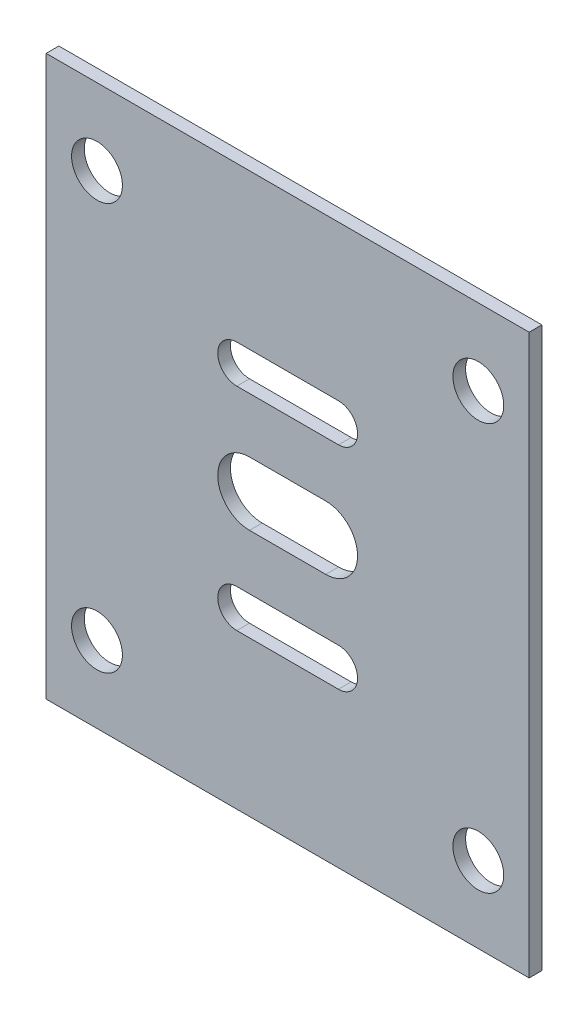
ISO-10303-21;
HEADER;
FILE_DESCRIPTION(('STEP AP214'),'2;1');
FILE_NAME('part.step','',(''),(''),'','','');
FILE_SCHEMA(('AUTOMOTIVE_DESIGN { 1 0 10303 214 1 1 1 1 }'));
ENDSEC;
DATA;
#1=APPLICATION_CONTEXT('core data for automotive mechanical design processes');
#2=APPLICATION_PROTOCOL_DEFINITION('international standard','automotive_design',2000,#1);
#3=PRODUCT_CONTEXT('',#1,'mechanical');
#4=PRODUCT('Part','Part','',(#3));
#5=PRODUCT_RELATED_PRODUCT_CATEGORY('part','',(#4));
#6=PRODUCT_DEFINITION_FORMATION('','',#4);
#7=PRODUCT_DEFINITION_CONTEXT('part definition',#1,'design');
#8=PRODUCT_DEFINITION('design','',#6,#7);
#9=PRODUCT_DEFINITION_SHAPE('','',#8);
#10=(LENGTH_UNIT() NAMED_UNIT(*) SI_UNIT(.MILLI.,.METRE.));
#11=(NAMED_UNIT(*) PLANE_ANGLE_UNIT() SI_UNIT($,.RADIAN.));
#12=(NAMED_UNIT(*) SI_UNIT($,.STERADIAN.) SOLID_ANGLE_UNIT());
#13=UNCERTAINTY_MEASURE_WITH_UNIT(LENGTH_MEASURE(1.E-05),#10,'distance_accuracy_value','');
#14=(GEOMETRIC_REPRESENTATION_CONTEXT(3) GLOBAL_UNCERTAINTY_ASSIGNED_CONTEXT((#13)) GLOBAL_UNIT_ASSIGNED_CONTEXT((#10,
#11,#12)) REPRESENTATION_CONTEXT('',''));
#15=CARTESIAN_POINT('',(0.,0.,0.));
#16=DIRECTION('',(0.,0.,1.));
#17=DIRECTION('',(1.,0.,0.));
#18=AXIS2_PLACEMENT_3D('',#15,#16,#17);
#19=CARTESIAN_POINT('',(0.,0.,1.));
#20=DIRECTION('',(0.,0.,-1.));
#21=DIRECTION('',(-1.,0.,0.));
#22=AXIS2_PLACEMENT_3D('',#19,#20,#21);
#23=PLANE('',#22);
#24=CARTESIAN_POINT('',(-4.,8.32701940273271,1.));
#25=DIRECTION('',(0.,0.,1.));
#26=DIRECTION('',(1.,0.,0.));
#27=AXIS2_PLACEMENT_3D('',#24,#25,#26);
#28=CIRCLE('',#27,1.5);
#29=CARTESIAN_POINT('',(-4.,9.82701940273271,1.));
#30=VERTEX_POINT('',#29);
#31=CARTESIAN_POINT('',(-4.,6.82701940273271,1.));
#32=VERTEX_POINT('',#31);
#33=EDGE_CURVE('E171',#30,#32,#28,.T.);
#34=ORIENTED_EDGE('',*,*,#33,.F.);
#35=DIRECTION('',(-1.,0.,0.));
#36=VECTOR('',#35,1.);
#37=CARTESIAN_POINT('',(-4.,9.82701940273271,1.));
#38=LINE('',#37,#36);
#39=CARTESIAN_POINT('',(4.,9.82701940273271,1.));
#40=VERTEX_POINT('',#39);
#41=EDGE_CURVE('E442',#40,#30,#38,.T.);
#42=ORIENTED_EDGE('',*,*,#41,.F.);
#43=CARTESIAN_POINT('',(4.,8.32701940273271,1.));
#44=DIRECTION('',(0.,0.,1.));
#45=DIRECTION('',(1.,0.,0.));
#46=AXIS2_PLACEMENT_3D('',#43,#44,#45);
#47=CIRCLE('',#46,1.5);
#48=CARTESIAN_POINT('',(4.,6.82701940273271,1.));
#49=VERTEX_POINT('',#48);
#50=EDGE_CURVE('E438',#49,#40,#47,.T.);
#51=ORIENTED_EDGE('',*,*,#50,.F.);
#52=DIRECTION('',(1.,0.,0.));
#53=VECTOR('',#52,1.);
#54=CARTESIAN_POINT('',(-4.,6.82701940273271,1.));
#55=LINE('',#54,#53);
#56=EDGE_CURVE('E234',#32,#49,#55,.T.);
#57=ORIENTED_EDGE('',*,*,#56,.F.);
#58=EDGE_LOOP('',(#34,#42,#51,#57));
#59=FACE_BOUND('',#58,.T.);
#60=CARTESIAN_POINT('',(15.,16.,1.));
#61=DIRECTION('',(0.,0.,1.));
#62=DIRECTION('',(-1.,0.,0.));
#63=AXIS2_PLACEMENT_3D('',#60,#61,#62);
#64=CIRCLE('',#63,2.);
#65=CARTESIAN_POINT('',(13.,16.,1.));
#66=VERTEX_POINT('',#65);
#67=EDGE_CURVE('E404',#66,#66,#64,.T.);
#68=ORIENTED_EDGE('',*,*,#67,.F.);
#69=EDGE_LOOP('',(#68));
#70=FACE_BOUND('',#69,.T.);
#71=CARTESIAN_POINT('',(15.,-16.,1.));
#72=DIRECTION('',(0.,0.,1.));
#73=DIRECTION('',(1.,0.,0.));
#74=AXIS2_PLACEMENT_3D('',#71,#72,#73);
#75=CIRCLE('',#74,2.);
#76=CARTESIAN_POINT('',(17.,-16.,1.));
#77=VERTEX_POINT('',#76);
#78=EDGE_CURVE('E409',#77,#77,#75,.T.);
#79=ORIENTED_EDGE('',*,*,#78,.F.);
#80=EDGE_LOOP('',(#79));
#81=FACE_BOUND('',#80,.T.);
#82=CARTESIAN_POINT('',(-15.,-16.,1.));
#83=DIRECTION('',(0.,0.,1.));
#84=DIRECTION('',(-1.,0.,0.));
#85=AXIS2_PLACEMENT_3D('',#82,#83,#84);
#86=CIRCLE('',#85,2.);
#87=CARTESIAN_POINT('',(-17.,-16.,1.));
#88=VERTEX_POINT('',#87);
#89=EDGE_CURVE('E415',#88,#88,#86,.T.);
#90=ORIENTED_EDGE('',*,*,#89,.F.);
#91=EDGE_LOOP('',(#90));
#92=FACE_BOUND('',#91,.T.);
#93=CARTESIAN_POINT('',(-15.,16.,1.));
#94=DIRECTION('',(0.,0.,1.));
#95=DIRECTION('',(1.,0.,0.));
#96=AXIS2_PLACEMENT_3D('',#93,#94,#95);
#97=CIRCLE('',#96,2.);
#98=CARTESIAN_POINT('',(-13.,16.,1.));
#99=VERTEX_POINT('',#98);
#100=EDGE_CURVE('E412',#99,#99,#97,.T.);
#101=ORIENTED_EDGE('',*,*,#100,.F.);
#102=EDGE_LOOP('',(#101));
#103=FACE_BOUND('',#102,.T.);
#104=DIRECTION('',(0.,1.,0.));
#105=VECTOR('',#104,1.);
#106=CARTESIAN_POINT('',(19.,-22.,1.));
#107=LINE('',#106,#105);
#108=CARTESIAN_POINT('',(19.,-22.,1.));
#109=VERTEX_POINT('',#108);
#110=CARTESIAN_POINT('',(19.,22.,1.));
#111=VERTEX_POINT('',#110);
#112=EDGE_CURVE('E420',#109,#111,#107,.T.);
#113=ORIENTED_EDGE('',*,*,#112,.T.);
#114=DIRECTION('',(-1.,0.,0.));
#115=VECTOR('',#114,1.);
#116=CARTESIAN_POINT('',(-19.,22.,1.));
#117=LINE('',#116,#115);
#118=CARTESIAN_POINT('',(-19.,22.,1.));
#119=VERTEX_POINT('',#118);
#120=EDGE_CURVE('E658',#111,#119,#117,.T.);
#121=ORIENTED_EDGE('',*,*,#120,.T.);
#122=DIRECTION('',(0.,-1.,0.));
#123=VECTOR('',#122,1.);
#124=CARTESIAN_POINT('',(-19.,-22.,1.));
#125=LINE('',#124,#123);
#126=CARTESIAN_POINT('',(-19.,-22.,1.));
#127=VERTEX_POINT('',#126);
#128=EDGE_CURVE('E659',#119,#127,#125,.T.);
#129=ORIENTED_EDGE('',*,*,#128,.T.);
#130=DIRECTION('',(1.,0.,0.));
#131=VECTOR('',#130,1.);
#132=CARTESIAN_POINT('',(-19.,-22.,1.));
#133=LINE('',#132,#131);
#134=EDGE_CURVE('E598',#127,#109,#133,.T.);
#135=ORIENTED_EDGE('',*,*,#134,.T.);
#136=EDGE_LOOP('',(#113,#121,#129,#135));
#137=FACE_BOUND('',#136,.T.);
#138=CARTESIAN_POINT('',(-3.,0.,1.));
#139=DIRECTION('',(0.,0.,1.));
#140=DIRECTION('',(1.,0.,0.));
#141=AXIS2_PLACEMENT_3D('',#138,#139,#140);
#142=CIRCLE('',#141,2.5);
#143=CARTESIAN_POINT('',(-3.,2.5,1.));
#144=VERTEX_POINT('',#143);
#145=CARTESIAN_POINT('',(-3.,-2.5,1.));
#146=VERTEX_POINT('',#145);
#147=EDGE_CURVE('E261',#144,#146,#142,.T.);
#148=ORIENTED_EDGE('',*,*,#147,.F.);
#149=DIRECTION('',(-1.,0.,0.));
#150=VECTOR('',#149,1.);
#151=CARTESIAN_POINT('',(-3.,2.5,1.));
#152=LINE('',#151,#150);
#153=CARTESIAN_POINT('',(3.,2.5,1.));
#154=VERTEX_POINT('',#153);
#155=EDGE_CURVE('E267',#154,#144,#152,.T.);
#156=ORIENTED_EDGE('',*,*,#155,.F.);
#157=CARTESIAN_POINT('',(3.,0.,1.));
#158=DIRECTION('',(0.,0.,1.));
#159=DIRECTION('',(1.,0.,0.));
#160=AXIS2_PLACEMENT_3D('',#157,#158,#159);
#161=CIRCLE('',#160,2.5);
#162=CARTESIAN_POINT('',(3.,-2.5,1.));
#163=VERTEX_POINT('',#162);
#164=EDGE_CURVE('E266',#163,#154,#161,.T.);
#165=ORIENTED_EDGE('',*,*,#164,.F.);
#166=DIRECTION('',(1.,0.,0.));
#167=VECTOR('',#166,1.);
#168=CARTESIAN_POINT('',(-3.,-2.5,1.));
#169=LINE('',#168,#167);
#170=EDGE_CURVE('E263',#146,#163,#169,.T.);
#171=ORIENTED_EDGE('',*,*,#170,.F.);
#172=EDGE_LOOP('',(#148,#156,#165,#171));
#173=FACE_BOUND('',#172,.T.);
#174=CARTESIAN_POINT('',(-4.,-8.32701940273271,1.));
#175=DIRECTION('',(0.,0.,1.));
#176=DIRECTION('',(-1.,0.,0.));
#177=AXIS2_PLACEMENT_3D('',#174,#175,#176);
#178=CIRCLE('',#177,1.5);
#179=CARTESIAN_POINT('',(-4.,-6.82701940273271,1.));
#180=VERTEX_POINT('',#179);
#181=CARTESIAN_POINT('',(-4.,-9.82701940273271,1.));
#182=VERTEX_POINT('',#181);
#183=EDGE_CURVE('E246',#180,#182,#178,.T.);
#184=ORIENTED_EDGE('',*,*,#183,.F.);
#185=DIRECTION('',(-1.,0.,0.));
#186=VECTOR('',#185,1.);
#187=CARTESIAN_POINT('',(-4.,-6.82701940273271,1.));
#188=LINE('',#187,#186);
#189=CARTESIAN_POINT('',(4.,-6.82701940273271,1.));
#190=VERTEX_POINT('',#189);
#191=EDGE_CURVE('E428',#190,#180,#188,.T.);
#192=ORIENTED_EDGE('',*,*,#191,.F.);
#193=CARTESIAN_POINT('',(4.,-8.32701940273271,1.));
#194=DIRECTION('',(0.,0.,1.));
#195=DIRECTION('',(-1.,0.,0.));
#196=AXIS2_PLACEMENT_3D('',#193,#194,#195);
#197=CIRCLE('',#196,1.5);
#198=CARTESIAN_POINT('',(4.,-9.82701940273271,1.));
#199=VERTEX_POINT('',#198);
#200=EDGE_CURVE('E260',#199,#190,#197,.T.);
#201=ORIENTED_EDGE('',*,*,#200,.F.);
#202=DIRECTION('',(1.,0.,0.));
#203=VECTOR('',#202,1.);
#204=CARTESIAN_POINT('',(-4.,-9.82701940273271,1.));
#205=LINE('',#204,#203);
#206=EDGE_CURVE('E247',#182,#199,#205,.T.);
#207=ORIENTED_EDGE('',*,*,#206,.F.);
#208=EDGE_LOOP('',(#184,#192,#201,#207));
#209=FACE_BOUND('',#208,.T.);
#210=ADVANCED_FACE('F39',(#59,#70,#81,#92,#103,#137,#173,#209),#23,.F.);
#211=CARTESIAN_POINT('',(0.,0.,0.));
#212=DIRECTION('',(0.,0.,-1.));
#213=DIRECTION('',(-1.,0.,0.));
#214=AXIS2_PLACEMENT_3D('',#211,#212,#213);
#215=PLANE('',#214);
#216=CARTESIAN_POINT('',(15.,-16.,0.));
#217=DIRECTION('',(0.,0.,1.));
#218=DIRECTION('',(1.,0.,0.));
#219=AXIS2_PLACEMENT_3D('',#216,#217,#218);
#220=CIRCLE('',#219,2.);
#221=CARTESIAN_POINT('',(17.,-16.,0.));
#222=VERTEX_POINT('',#221);
#223=EDGE_CURVE('E642',#222,#222,#220,.T.);
#224=ORIENTED_EDGE('',*,*,#223,.T.);
#225=EDGE_LOOP('',(#224));
#226=FACE_BOUND('',#225,.T.);
#227=CARTESIAN_POINT('',(-15.,16.,0.));
#228=DIRECTION('',(0.,0.,1.));
#229=DIRECTION('',(1.,0.,0.));
#230=AXIS2_PLACEMENT_3D('',#227,#228,#229);
#231=CIRCLE('',#230,2.);
#232=CARTESIAN_POINT('',(-13.,16.,0.));
#233=VERTEX_POINT('',#232);
#234=EDGE_CURVE('E594',#233,#233,#231,.T.);
#235=ORIENTED_EDGE('',*,*,#234,.T.);
#236=EDGE_LOOP('',(#235));
#237=FACE_BOUND('',#236,.T.);
#238=DIRECTION('',(0.,1.,0.));
#239=VECTOR('',#238,1.);
#240=CARTESIAN_POINT('',(19.,-22.,0.));
#241=LINE('',#240,#239);
#242=CARTESIAN_POINT('',(19.,-22.,0.));
#243=VERTEX_POINT('',#242);
#244=CARTESIAN_POINT('',(19.,22.,0.));
#245=VERTEX_POINT('',#244);
#246=EDGE_CURVE('E588',#243,#245,#241,.T.);
#247=ORIENTED_EDGE('',*,*,#246,.F.);
#248=DIRECTION('',(1.,0.,0.));
#249=VECTOR('',#248,1.);
#250=CARTESIAN_POINT('',(-19.,-22.,0.));
#251=LINE('',#250,#249);
#252=CARTESIAN_POINT('',(-19.,-22.,0.));
#253=VERTEX_POINT('',#252);
#254=EDGE_CURVE('E605',#253,#243,#251,.T.);
#255=ORIENTED_EDGE('',*,*,#254,.F.);
#256=DIRECTION('',(0.,-1.,0.));
#257=VECTOR('',#256,1.);
#258=CARTESIAN_POINT('',(-19.,-22.,0.));
#259=LINE('',#258,#257);
#260=CARTESIAN_POINT('',(-19.,22.,0.));
#261=VERTEX_POINT('',#260);
#262=EDGE_CURVE('E593',#261,#253,#259,.T.);
#263=ORIENTED_EDGE('',*,*,#262,.F.);
#264=DIRECTION('',(-1.,0.,0.));
#265=VECTOR('',#264,1.);
#266=CARTESIAN_POINT('',(-19.,22.,0.));
#267=LINE('',#266,#265);
#268=EDGE_CURVE('E591',#245,#261,#267,.T.);
#269=ORIENTED_EDGE('',*,*,#268,.F.);
#270=EDGE_LOOP('',(#247,#255,#263,#269));
#271=FACE_BOUND('',#270,.T.);
#272=CARTESIAN_POINT('',(-15.,-16.,0.));
#273=DIRECTION('',(0.,0.,1.));
#274=DIRECTION('',(-1.,0.,0.));
#275=AXIS2_PLACEMENT_3D('',#272,#273,#274);
#276=CIRCLE('',#275,2.);
#277=CARTESIAN_POINT('',(-17.,-16.,0.));
#278=VERTEX_POINT('',#277);
#279=EDGE_CURVE('E649',#278,#278,#276,.T.);
#280=ORIENTED_EDGE('',*,*,#279,.T.);
#281=EDGE_LOOP('',(#280));
#282=FACE_BOUND('',#281,.T.);
#283=CARTESIAN_POINT('',(15.,16.,0.));
#284=DIRECTION('',(0.,0.,1.));
#285=DIRECTION('',(-1.,0.,0.));
#286=AXIS2_PLACEMENT_3D('',#283,#284,#285);
#287=CIRCLE('',#286,2.);
#288=CARTESIAN_POINT('',(13.,16.,0.));
#289=VERTEX_POINT('',#288);
#290=EDGE_CURVE('E646',#289,#289,#287,.T.);
#291=ORIENTED_EDGE('',*,*,#290,.T.);
#292=EDGE_LOOP('',(#291));
#293=FACE_BOUND('',#292,.T.);
#294=DIRECTION('',(-1.,0.,0.));
#295=VECTOR('',#294,1.);
#296=CARTESIAN_POINT('',(0.,2.5,0.));
#297=LINE('',#296,#295);
#298=CARTESIAN_POINT('',(3.,2.5,-5.99999999998605E-06));
#299=VERTEX_POINT('',#298);
#300=CARTESIAN_POINT('',(-3.,2.5,-5.99999999998605E-06));
#301=VERTEX_POINT('',#300);
#302=EDGE_CURVE('E262',#299,#301,#297,.T.);
#303=ORIENTED_EDGE('',*,*,#302,.T.);
#304=CARTESIAN_POINT('',(-3.,2.5,0.));
#305=CARTESIAN_POINT('',(-3.49700789391648,2.5,0.));
#306=CARTESIAN_POINT('',(-3.95670858091273,2.30969883127822,0.));
#307=CARTESIAN_POINT('',(-4.41569110742849,2.11969495769353,0.));
#308=CARTESIAN_POINT('',(-4.76776695296637,1.76776695296637,0.));
#309=CARTESIAN_POINT('',(-5.11910018048842,1.41658125442095,0.));
#310=CARTESIAN_POINT('',(-5.30969883127822,0.956708580912725,0.));
#311=CARTESIAN_POINT('',(-5.49989546076021,0.497805896503908,0.));
#312=CARTESIAN_POINT('',(-5.5,0.,0.));
#313=CARTESIAN_POINT('',(-5.50010431873979,-0.496755896534974,0.));
#314=CARTESIAN_POINT('',(-5.30969883127822,-0.956708580912726,0.));
#315=CARTESIAN_POINT('',(-5.11969495769296,-1.41569110742916,0.));
#316=CARTESIAN_POINT('',(-4.76776695296637,-1.76776695296637,0.));
#317=CARTESIAN_POINT('',(-4.41658125442051,-2.11910018048876,0.));
#318=CARTESIAN_POINT('',(-3.95670858091272,-2.30969883127822,0.));
#319=CARTESIAN_POINT('',(-3.49755366628317,-2.5,0.));
#320=CARTESIAN_POINT('',(-3.,-2.5,0.));
#321=B_SPLINE_CURVE_WITH_KNOTS('',2,(#304,#305,#306,#307,#308,#309,#310,#311,#312,#313,#314,
#315,#316,#317,#318,#319,#320),.UNSPECIFIED.,.F.,.F.,(3,2,2,2,2,2,2,2,3),(0.,0.125,0.25,0.375,
0.5,0.625,0.75,0.875,1.),.UNSPECIFIED.);
#322=CARTESIAN_POINT('',(-3.,-2.5,-5.99999999998605E-06));
#323=VERTEX_POINT('',#322);
#324=EDGE_CURVE('E185',#301,#323,#321,.T.);
#325=ORIENTED_EDGE('',*,*,#324,.T.);
#326=DIRECTION('',(-1.,0.,0.));
#327=VECTOR('',#326,1.);
#328=CARTESIAN_POINT('',(0.,-2.5,0.));
#329=LINE('',#328,#327);
#330=CARTESIAN_POINT('',(3.,-2.5,-5.99999999998605E-06));
#331=VERTEX_POINT('',#330);
#332=EDGE_CURVE('E613',#323,#331,#329,.F.);
#333=ORIENTED_EDGE('',*,*,#332,.T.);
#334=CARTESIAN_POINT('',(3.,-2.5,0.));
#335=CARTESIAN_POINT('',(3.49700789391648,-2.5,0.));
#336=CARTESIAN_POINT('',(3.95670858091272,-2.30969883127822,0.));
#337=CARTESIAN_POINT('',(4.41569110742849,-2.11969495769353,0.));
#338=CARTESIAN_POINT('',(4.76776695296637,-1.76776695296637,0.));
#339=CARTESIAN_POINT('',(5.11910018048775,-1.41658125442162,0.));
#340=CARTESIAN_POINT('',(5.30969883127822,-0.956708580912723,0.));
#341=CARTESIAN_POINT('',(5.49989546076021,-0.497805896504848,0.));
#342=CARTESIAN_POINT('',(5.5,0.,0.));
#343=CARTESIAN_POINT('',(5.50010431873979,0.496755896534444,0.));
#344=CARTESIAN_POINT('',(5.30969883127822,0.956708580912724,0.));
#345=CARTESIAN_POINT('',(5.11969495769327,1.41569110742896,0.));
#346=CARTESIAN_POINT('',(4.76776695296637,1.76776695296637,0.));
#347=CARTESIAN_POINT('',(4.4165812544204,2.11910018048877,0.));
#348=CARTESIAN_POINT('',(3.95670858091272,2.30969883127822,0.));
#349=CARTESIAN_POINT('',(3.49755366628326,2.5,0.));
#350=CARTESIAN_POINT('',(3.,2.5,0.));
#351=B_SPLINE_CURVE_WITH_KNOTS('',2,(#334,#335,#336,#337,#338,#339,#340,#341,#342,#343,#344,
#345,#346,#347,#348,#349,#350),.UNSPECIFIED.,.F.,.F.,(3,2,2,2,2,2,2,2,3),(0.,0.125,0.25,0.375,
0.5,0.625,0.75,0.875,1.),.UNSPECIFIED.);
#352=EDGE_CURVE('E611',#331,#299,#351,.T.);
#353=ORIENTED_EDGE('',*,*,#352,.T.);
#354=EDGE_LOOP('',(#303,#325,#333,#353));
#355=FACE_BOUND('',#354,.T.);
#356=DIRECTION('',(-1.,0.,0.));
#357=VECTOR('',#356,1.);
#358=CARTESIAN_POINT('',(0.,9.82701940273271,0.));
#359=LINE('',#358,#357);
#360=CARTESIAN_POINT('',(4.,9.82701940273271,-5.99999999998605E-06));
#361=VERTEX_POINT('',#360);
#362=CARTESIAN_POINT('',(-4.,9.82701940273271,-5.99999999998605E-06));
#363=VERTEX_POINT('',#362);
#364=EDGE_CURVE('E182',#361,#363,#359,.T.);
#365=ORIENTED_EDGE('',*,*,#364,.T.);
#366=CARTESIAN_POINT('',(-4.,9.82701940273271,0.));
#367=CARTESIAN_POINT('',(-4.29800071957235,9.82701940273271,0.));
#368=CARTESIAN_POINT('',(-4.57402514854764,9.71283870149964,0.));
#369=CARTESIAN_POINT('',(-4.84908231185741,9.59905812090943,0.));
#370=CARTESIAN_POINT('',(-5.06066017177982,9.38767957451253,0.));
#371=CARTESIAN_POINT('',(-5.27123791211576,9.1773002055555,0.));
#372=CARTESIAN_POINT('',(-5.38581929876693,8.90104455128034,0.));
#373=CARTESIAN_POINT('',(-5.49985906405451,8.62609474578692,0.));
#374=CARTESIAN_POINT('',(-5.5,8.32701940273271,0.));
#375=CARTESIAN_POINT('',(-5.50014026974724,8.02935777616335,0.));
#376=CARTESIAN_POINT('',(-5.38581929876693,7.75299425418507,0.));
#377=CARTESIAN_POINT('',(-5.27203871817672,7.47793709087548,0.));
#378=CARTESIAN_POINT('',(-5.06066017177982,7.26635923095289,0.));
#379=CARTESIAN_POINT('',(-4.8502808028231,7.05578149061707,0.));
#380=CARTESIAN_POINT('',(-4.57402514854764,6.94120010396578,0.));
#381=CARTESIAN_POINT('',(-4.29873554657443,6.82701940273271,0.));
#382=CARTESIAN_POINT('',(-4.,6.82701940273271,0.));
#383=B_SPLINE_CURVE_WITH_KNOTS('',2,(#366,#367,#368,#369,#370,#371,#372,#373,#374,#375,#376,
#377,#378,#379,#380,#381,#382),.UNSPECIFIED.,.F.,.F.,(3,2,2,2,2,2,2,2,3),(0.,0.125,0.25,0.375,
0.5,0.625,0.75,0.875,1.),.UNSPECIFIED.);
#384=CARTESIAN_POINT('',(-4.,6.82701940273271,-5.99999999998605E-06));
#385=VERTEX_POINT('',#384);
#386=EDGE_CURVE('E164',#363,#385,#383,.T.);
#387=ORIENTED_EDGE('',*,*,#386,.T.);
#388=DIRECTION('',(-1.,0.,0.));
#389=VECTOR('',#388,1.);
#390=CARTESIAN_POINT('',(0.,6.82701940273271,0.));
#391=LINE('',#390,#389);
#392=CARTESIAN_POINT('',(4.,6.82701940273271,-5.99999999998605E-06));
#393=VERTEX_POINT('',#392);
#394=EDGE_CURVE('E152',#385,#393,#391,.F.);
#395=ORIENTED_EDGE('',*,*,#394,.T.);
#396=CARTESIAN_POINT('',(4.,6.82701940273271,0.));
#397=CARTESIAN_POINT('',(4.29800071957297,6.82701940273271,0.));
#398=CARTESIAN_POINT('',(4.57402514854763,6.94120010396578,0.));
#399=CARTESIAN_POINT('',(4.84908231185754,7.0549806845563,0.));
#400=CARTESIAN_POINT('',(5.06066017177982,7.26635923095289,0.));
#401=CARTESIAN_POINT('',(5.27123791211576,7.47673859990973,0.));
#402=CARTESIAN_POINT('',(5.38581929876693,7.75299425418507,0.));
#403=CARTESIAN_POINT('',(5.49985906405451,8.02794405967868,0.));
#404=CARTESIAN_POINT('',(5.5,8.32701940273271,0.));
#405=CARTESIAN_POINT('',(5.50014026974724,8.62468102930233,0.));
#406=CARTESIAN_POINT('',(5.38581929876693,8.90104455128034,0.));
#407=CARTESIAN_POINT('',(5.27203871817654,9.17610171459012,0.));
#408=CARTESIAN_POINT('',(5.06066017177982,9.38767957451253,0.));
#409=CARTESIAN_POINT('',(4.85028080282342,9.59825731484803,0.));
#410=CARTESIAN_POINT('',(4.57402514854764,9.71283870149964,0.));
#411=CARTESIAN_POINT('',(4.29873554657487,9.82701940273271,0.));
#412=CARTESIAN_POINT('',(4.,9.82701940273271,0.));
#413=B_SPLINE_CURVE_WITH_KNOTS('',2,(#396,#397,#398,#399,#400,#401,#402,#403,#404,#405,#406,
#407,#408,#409,#410,#411,#412),.UNSPECIFIED.,.F.,.F.,(3,2,2,2,2,2,2,2,3),(0.,0.125,0.25,0.375,
0.5,0.625,0.75,0.875,1.),.UNSPECIFIED.);
#414=EDGE_CURVE('E167',#393,#361,#413,.T.);
#415=ORIENTED_EDGE('',*,*,#414,.T.);
#416=EDGE_LOOP('',(#365,#387,#395,#415));
#417=FACE_BOUND('',#416,.T.);
#418=DIRECTION('',(-1.,0.,0.));
#419=VECTOR('',#418,1.);
#420=CARTESIAN_POINT('',(0.,-6.82701940273271,0.));
#421=LINE('',#420,#419);
#422=CARTESIAN_POINT('',(4.,-6.82701940273271,-5.99999999999283E-06));
#423=VERTEX_POINT('',#422);
#424=CARTESIAN_POINT('',(-4.,-6.82701940273271,-5.99999999999283E-06));
#425=VERTEX_POINT('',#424);
#426=EDGE_CURVE('E248',#423,#425,#421,.T.);
#427=ORIENTED_EDGE('',*,*,#426,.T.);
#428=CARTESIAN_POINT('',(-4.,-6.82701940273271,0.));
#429=CARTESIAN_POINT('',(-4.29800071957279,-6.82701940273271,0.));
#430=CARTESIAN_POINT('',(-4.57402514854763,-6.94120010396578,0.));
#431=CARTESIAN_POINT('',(-4.84908231185741,-7.05498068455617,0.));
#432=CARTESIAN_POINT('',(-5.06066017177982,-7.26635923095289,0.));
#433=CARTESIAN_POINT('',(-5.27123791211563,-7.47673859990961,0.));
#434=CARTESIAN_POINT('',(-5.38581929876693,-7.75299425418507,0.));
#435=CARTESIAN_POINT('',(-5.4998590640545,-8.0279440596785,0.));
#436=CARTESIAN_POINT('',(-5.5,-8.32701940273271,0.));
#437=CARTESIAN_POINT('',(-5.50014026974724,-8.62468102930225,0.));
#438=CARTESIAN_POINT('',(-5.38581929876693,-8.90104455128034,0.));
#439=CARTESIAN_POINT('',(-5.27203871817659,-9.17610171459007,0.));
#440=CARTESIAN_POINT('',(-5.06066017177982,-9.38767957451253,0.));
#441=CARTESIAN_POINT('',(-4.85028080282341,-9.59825731484803,0.));
#442=CARTESIAN_POINT('',(-4.57402514854763,-9.71283870149964,0.));
#443=CARTESIAN_POINT('',(-4.29873554657486,-9.82701940273271,0.));
#444=CARTESIAN_POINT('',(-4.,-9.82701940273271,0.));
#445=B_SPLINE_CURVE_WITH_KNOTS('',2,(#428,#429,#430,#431,#432,#433,#434,#435,#436,#437,#438,
#439,#440,#441,#442,#443,#444),.UNSPECIFIED.,.F.,.F.,(3,2,2,2,2,2,2,2,3),(0.,0.125,0.25,0.375,
0.5,0.625,0.75,0.875,1.),.UNSPECIFIED.);
#446=CARTESIAN_POINT('',(-4.,-9.82701940273271,-5.99999999999283E-06));
#447=VERTEX_POINT('',#446);
#448=EDGE_CURVE('E173',#425,#447,#445,.T.);
#449=ORIENTED_EDGE('',*,*,#448,.T.);
#450=DIRECTION('',(-1.,0.,0.));
#451=VECTOR('',#450,1.);
#452=CARTESIAN_POINT('',(0.,-9.82701940273271,0.));
#453=LINE('',#452,#451);
#454=CARTESIAN_POINT('',(4.,-9.82701940273271,-5.99999999999283E-06));
#455=VERTEX_POINT('',#454);
#456=EDGE_CURVE('E242',#447,#455,#453,.F.);
#457=ORIENTED_EDGE('',*,*,#456,.T.);
#458=CARTESIAN_POINT('',(4.,-9.82701940273271,0.));
#459=CARTESIAN_POINT('',(4.29800071957253,-9.82701940273271,0.));
#460=CARTESIAN_POINT('',(4.57402514854763,-9.71283870149964,0.));
#461=CARTESIAN_POINT('',(4.84908231185754,-9.59905812090929,0.));
#462=CARTESIAN_POINT('',(5.06066017177982,-9.38767957451253,0.));
#463=CARTESIAN_POINT('',(5.27123791211602,-9.17730020555524,0.));
#464=CARTESIAN_POINT('',(5.38581929876693,-8.90104455128034,0.));
#465=CARTESIAN_POINT('',(5.4998590640545,-8.62609474578655,0.));
#466=CARTESIAN_POINT('',(5.5,-8.32701940273271,0.));
#467=CARTESIAN_POINT('',(5.50014026974724,-8.02935777616291,0.));
#468=CARTESIAN_POINT('',(5.38581929876693,-7.75299425418507,0.));
#469=CARTESIAN_POINT('',(5.2720387181764,-7.47793709087517,0.));
#470=CARTESIAN_POINT('',(5.06066017177982,-7.26635923095289,0.));
#471=CARTESIAN_POINT('',(4.8502808028231,-7.05578149061707,0.));
#472=CARTESIAN_POINT('',(4.57402514854763,-6.94120010396578,0.));
#473=CARTESIAN_POINT('',(4.29873554657442,-6.82701940273271,0.));
#474=CARTESIAN_POINT('',(4.,-6.82701940273271,0.));
#475=B_SPLINE_CURVE_WITH_KNOTS('',2,(#458,#459,#460,#461,#462,#463,#464,#465,#466,#467,#468,
#469,#470,#471,#472,#473,#474),.UNSPECIFIED.,.F.,.F.,(3,2,2,2,2,2,2,2,3),(0.,0.125,0.25,0.375,
0.5,0.625,0.75,0.875,1.),.UNSPECIFIED.);
#476=EDGE_CURVE('E241',#455,#423,#475,.T.);
#477=ORIENTED_EDGE('',*,*,#476,.T.);
#478=EDGE_LOOP('',(#427,#449,#457,#477));
#479=FACE_BOUND('',#478,.T.);
#480=ADVANCED_FACE('F179',(#226,#237,#271,#282,#293,#355,#417,#479),#215,.T.);
#481=CARTESIAN_POINT('',(19.,-22.,1.));
#482=DIRECTION('',(-1.,0.,0.));
#483=DIRECTION('',(0.,0.,1.));
#484=AXIS2_PLACEMENT_3D('',#481,#482,#483);
#485=PLANE('',#484);
#486=ORIENTED_EDGE('',*,*,#246,.T.);
#487=DIRECTION('',(0.,0.,-1.));
#488=VECTOR('',#487,1.);
#489=CARTESIAN_POINT('',(19.,22.,1.));
#490=LINE('',#489,#488);
#491=EDGE_CURVE('E11',#111,#245,#490,.T.);
#492=ORIENTED_EDGE('',*,*,#491,.F.);
#493=ORIENTED_EDGE('',*,*,#112,.F.);
#494=DIRECTION('',(0.,0.,-1.));
#495=VECTOR('',#494,1.);
#496=CARTESIAN_POINT('',(19.,-22.,1.));
#497=LINE('',#496,#495);
#498=EDGE_CURVE('E586',#109,#243,#497,.T.);
#499=ORIENTED_EDGE('',*,*,#498,.T.);
#500=EDGE_LOOP('',(#486,#492,#493,#499));
#501=FACE_BOUND('',#500,.T.);
#502=ADVANCED_FACE('F41',(#501),#485,.F.);
#503=CARTESIAN_POINT('',(-19.,22.,1.));
#504=DIRECTION('',(0.,-1.,0.));
#505=DIRECTION('',(0.,0.,-1.));
#506=AXIS2_PLACEMENT_3D('',#503,#504,#505);
#507=PLANE('',#506);
#508=ORIENTED_EDGE('',*,*,#268,.T.);
#509=DIRECTION('',(0.,0.,-1.));
#510=VECTOR('',#509,1.);
#511=CARTESIAN_POINT('',(-19.,22.,1.));
#512=LINE('',#511,#510);
#513=EDGE_CURVE('E48',#119,#261,#512,.T.);
#514=ORIENTED_EDGE('',*,*,#513,.F.);
#515=ORIENTED_EDGE('',*,*,#120,.F.);
#516=ORIENTED_EDGE('',*,*,#491,.T.);
#517=EDGE_LOOP('',(#508,#514,#515,#516));
#518=FACE_BOUND('',#517,.T.);
#519=ADVANCED_FACE('F565',(#518),#507,.F.);
#520=CARTESIAN_POINT('',(-19.,-22.,1.));
#521=DIRECTION('',(1.,0.,0.));
#522=DIRECTION('',(0.,0.,-1.));
#523=AXIS2_PLACEMENT_3D('',#520,#521,#522);
#524=PLANE('',#523);
#525=ORIENTED_EDGE('',*,*,#262,.T.);
#526=DIRECTION('',(0.,0.,-1.));
#527=VECTOR('',#526,1.);
#528=CARTESIAN_POINT('',(-19.,-22.,1.));
#529=LINE('',#528,#527);
#530=EDGE_CURVE('E604',#127,#253,#529,.T.);
#531=ORIENTED_EDGE('',*,*,#530,.F.);
#532=ORIENTED_EDGE('',*,*,#128,.F.);
#533=ORIENTED_EDGE('',*,*,#513,.T.);
#534=EDGE_LOOP('',(#525,#531,#532,#533));
#535=FACE_BOUND('',#534,.T.);
#536=ADVANCED_FACE('F392',(#535),#524,.F.);
#537=CARTESIAN_POINT('',(-19.,-22.,1.));
#538=DIRECTION('',(0.,1.,0.));
#539=DIRECTION('',(0.,0.,1.));
#540=AXIS2_PLACEMENT_3D('',#537,#538,#539);
#541=PLANE('',#540);
#542=ORIENTED_EDGE('',*,*,#254,.T.);
#543=ORIENTED_EDGE('',*,*,#498,.F.);
#544=ORIENTED_EDGE('',*,*,#134,.F.);
#545=ORIENTED_EDGE('',*,*,#530,.T.);
#546=EDGE_LOOP('',(#542,#543,#544,#545));
#547=FACE_BOUND('',#546,.T.);
#548=ADVANCED_FACE('F202',(#547),#541,.F.);
#549=CARTESIAN_POINT('',(-15.,16.,1.));
#550=DIRECTION('',(0.,0.,-1.));
#551=DIRECTION('',(-1.,0.,0.));
#552=AXIS2_PLACEMENT_3D('',#549,#550,#551);
#553=CYLINDRICAL_SURFACE('',#552,2.);
#554=ORIENTED_EDGE('',*,*,#100,.T.);
#555=EDGE_LOOP('',(#554));
#556=FACE_BOUND('',#555,.T.);
#557=ORIENTED_EDGE('',*,*,#234,.F.);
#558=EDGE_LOOP('',(#557));
#559=FACE_BOUND('',#558,.T.);
#560=ADVANCED_FACE('F383',(#556,#559),#553,.F.);
#561=CARTESIAN_POINT('',(-15.,-16.,1.));
#562=DIRECTION('',(0.,0.,-1.));
#563=DIRECTION('',(-1.,0.,0.));
#564=AXIS2_PLACEMENT_3D('',#561,#562,#563);
#565=CYLINDRICAL_SURFACE('',#564,2.);
#566=ORIENTED_EDGE('',*,*,#89,.T.);
#567=EDGE_LOOP('',(#566));
#568=FACE_BOUND('',#567,.T.);
#569=ORIENTED_EDGE('',*,*,#279,.F.);
#570=EDGE_LOOP('',(#569));
#571=FACE_BOUND('',#570,.T.);
#572=ADVANCED_FACE('F381',(#568,#571),#565,.F.);
#573=CARTESIAN_POINT('',(15.,-16.,1.));
#574=DIRECTION('',(0.,0.,-1.));
#575=DIRECTION('',(-1.,0.,0.));
#576=AXIS2_PLACEMENT_3D('',#573,#574,#575);
#577=CYLINDRICAL_SURFACE('',#576,2.);
#578=ORIENTED_EDGE('',*,*,#78,.T.);
#579=EDGE_LOOP('',(#578));
#580=FACE_BOUND('',#579,.T.);
#581=ORIENTED_EDGE('',*,*,#223,.F.);
#582=EDGE_LOOP('',(#581));
#583=FACE_BOUND('',#582,.T.);
#584=ADVANCED_FACE('F380',(#580,#583),#577,.F.);
#585=CARTESIAN_POINT('',(15.,16.,1.));
#586=DIRECTION('',(0.,0.,-1.));
#587=DIRECTION('',(-1.,0.,0.));
#588=AXIS2_PLACEMENT_3D('',#585,#586,#587);
#589=CYLINDRICAL_SURFACE('',#588,2.);
#590=ORIENTED_EDGE('',*,*,#67,.T.);
#591=EDGE_LOOP('',(#590));
#592=FACE_BOUND('',#591,.T.);
#593=ORIENTED_EDGE('',*,*,#290,.F.);
#594=EDGE_LOOP('',(#593));
#595=FACE_BOUND('',#594,.T.);
#596=ADVANCED_FACE('F373',(#592,#595),#589,.F.);
#597=CARTESIAN_POINT('',(-3.,0.,1.));
#598=DIRECTION('',(0.,0.,-1.));
#599=DIRECTION('',(-1.,0.,0.));
#600=AXIS2_PLACEMENT_3D('',#597,#598,#599);
#601=CYLINDRICAL_SURFACE('',#600,2.5);
#602=ORIENTED_EDGE('',*,*,#324,.F.);
#603=DIRECTION('',(0.,0.,-1.));
#604=VECTOR('',#603,1.);
#605=CARTESIAN_POINT('',(-3.,2.5,1.));
#606=LINE('',#605,#604);
#607=EDGE_CURVE('E271',#144,#301,#606,.T.);
#608=ORIENTED_EDGE('',*,*,#607,.F.);
#609=ORIENTED_EDGE('',*,*,#147,.T.);
#610=DIRECTION('',(0.,0.,-1.));
#611=VECTOR('',#610,1.);
#612=CARTESIAN_POINT('',(-3.,-2.5,1.));
#613=LINE('',#612,#611);
#614=EDGE_CURVE('E643',#146,#323,#613,.T.);
#615=ORIENTED_EDGE('',*,*,#614,.T.);
#616=EDGE_LOOP('',(#602,#608,#609,#615));
#617=FACE_BOUND('',#616,.T.);
#618=ADVANCED_FACE('F362',(#617),#601,.F.);
#619=CARTESIAN_POINT('',(-3.,-2.5,1.));
#620=DIRECTION('',(0.,1.,0.));
#621=DIRECTION('',(0.,0.,1.));
#622=AXIS2_PLACEMENT_3D('',#619,#620,#621);
#623=PLANE('',#622);
#624=ORIENTED_EDGE('',*,*,#332,.F.);
#625=ORIENTED_EDGE('',*,*,#614,.F.);
#626=ORIENTED_EDGE('',*,*,#170,.T.);
#627=DIRECTION('',(0.,0.,-1.));
#628=VECTOR('',#627,1.);
#629=CARTESIAN_POINT('',(3.,-2.5,1.));
#630=LINE('',#629,#628);
#631=EDGE_CURVE('E624',#163,#331,#630,.T.);
#632=ORIENTED_EDGE('',*,*,#631,.T.);
#633=EDGE_LOOP('',(#624,#625,#626,#632));
#634=FACE_BOUND('',#633,.T.);
#635=ADVANCED_FACE('F375',(#634),#623,.T.);
#636=CARTESIAN_POINT('',(3.,0.,1.));
#637=DIRECTION('',(0.,0.,-1.));
#638=DIRECTION('',(-1.,0.,0.));
#639=AXIS2_PLACEMENT_3D('',#636,#637,#638);
#640=CYLINDRICAL_SURFACE('',#639,2.5);
#641=ORIENTED_EDGE('',*,*,#352,.F.);
#642=ORIENTED_EDGE('',*,*,#631,.F.);
#643=ORIENTED_EDGE('',*,*,#164,.T.);
#644=DIRECTION('',(0.,0.,-1.));
#645=VECTOR('',#644,1.);
#646=CARTESIAN_POINT('',(3.,2.5,1.));
#647=LINE('',#646,#645);
#648=EDGE_CURVE('E627',#154,#299,#647,.T.);
#649=ORIENTED_EDGE('',*,*,#648,.T.);
#650=EDGE_LOOP('',(#641,#642,#643,#649));
#651=FACE_BOUND('',#650,.T.);
#652=ADVANCED_FACE('F502',(#651),#640,.F.);
#653=CARTESIAN_POINT('',(-3.,2.5,1.));
#654=DIRECTION('',(0.,-1.,0.));
#655=DIRECTION('',(0.,0.,-1.));
#656=AXIS2_PLACEMENT_3D('',#653,#654,#655);
#657=PLANE('',#656);
#658=ORIENTED_EDGE('',*,*,#302,.F.);
#659=ORIENTED_EDGE('',*,*,#648,.F.);
#660=ORIENTED_EDGE('',*,*,#155,.T.);
#661=ORIENTED_EDGE('',*,*,#607,.T.);
#662=EDGE_LOOP('',(#658,#659,#660,#661));
#663=FACE_BOUND('',#662,.T.);
#664=ADVANCED_FACE('F331',(#663),#657,.T.);
#665=CARTESIAN_POINT('',(-4.,8.32701940273271,1.));
#666=DIRECTION('',(0.,0.,-1.));
#667=DIRECTION('',(-1.,0.,0.));
#668=AXIS2_PLACEMENT_3D('',#665,#666,#667);
#669=CYLINDRICAL_SURFACE('',#668,1.5);
#670=ORIENTED_EDGE('',*,*,#386,.F.);
#671=DIRECTION('',(0.,0.,-1.));
#672=VECTOR('',#671,1.);
#673=CARTESIAN_POINT('',(-4.,9.82701940273271,1.));
#674=LINE('',#673,#672);
#675=EDGE_CURVE('E322',#30,#363,#674,.T.);
#676=ORIENTED_EDGE('',*,*,#675,.F.);
#677=ORIENTED_EDGE('',*,*,#33,.T.);
#678=DIRECTION('',(0.,0.,-1.));
#679=VECTOR('',#678,1.);
#680=CARTESIAN_POINT('',(-4.,6.82701940273271,1.));
#681=LINE('',#680,#679);
#682=EDGE_CURVE('E160',#32,#385,#681,.T.);
#683=ORIENTED_EDGE('',*,*,#682,.T.);
#684=EDGE_LOOP('',(#670,#676,#677,#683));
#685=FACE_BOUND('',#684,.T.);
#686=ADVANCED_FACE('F166',(#685),#669,.F.);
#687=CARTESIAN_POINT('',(-4.,6.82701940273271,1.));
#688=DIRECTION('',(0.,1.,0.));
#689=DIRECTION('',(0.,0.,1.));
#690=AXIS2_PLACEMENT_3D('',#687,#688,#689);
#691=PLANE('',#690);
#692=ORIENTED_EDGE('',*,*,#394,.F.);
#693=ORIENTED_EDGE('',*,*,#682,.F.);
#694=ORIENTED_EDGE('',*,*,#56,.T.);
#695=DIRECTION('',(0.,0.,-1.));
#696=VECTOR('',#695,1.);
#697=CARTESIAN_POINT('',(4.,6.82701940273271,1.));
#698=LINE('',#697,#696);
#699=EDGE_CURVE('E159',#49,#393,#698,.T.);
#700=ORIENTED_EDGE('',*,*,#699,.T.);
#701=EDGE_LOOP('',(#692,#693,#694,#700));
#702=FACE_BOUND('',#701,.T.);
#703=ADVANCED_FACE('F156',(#702),#691,.T.);
#704=CARTESIAN_POINT('',(4.,8.32701940273271,1.));
#705=DIRECTION('',(0.,0.,-1.));
#706=DIRECTION('',(-1.,0.,0.));
#707=AXIS2_PLACEMENT_3D('',#704,#705,#706);
#708=CYLINDRICAL_SURFACE('',#707,1.5);
#709=ORIENTED_EDGE('',*,*,#414,.F.);
#710=ORIENTED_EDGE('',*,*,#699,.F.);
#711=ORIENTED_EDGE('',*,*,#50,.T.);
#712=DIRECTION('',(0.,0.,-1.));
#713=VECTOR('',#712,1.);
#714=CARTESIAN_POINT('',(4.,9.82701940273271,1.));
#715=LINE('',#714,#713);
#716=EDGE_CURVE('E61',#40,#361,#715,.T.);
#717=ORIENTED_EDGE('',*,*,#716,.T.);
#718=EDGE_LOOP('',(#709,#710,#711,#717));
#719=FACE_BOUND('',#718,.T.);
#720=ADVANCED_FACE('F337',(#719),#708,.F.);
#721=CARTESIAN_POINT('',(-4.,9.82701940273271,1.));
#722=DIRECTION('',(0.,-1.,0.));
#723=DIRECTION('',(0.,0.,-1.));
#724=AXIS2_PLACEMENT_3D('',#721,#722,#723);
#725=PLANE('',#724);
#726=ORIENTED_EDGE('',*,*,#364,.F.);
#727=ORIENTED_EDGE('',*,*,#716,.F.);
#728=ORIENTED_EDGE('',*,*,#41,.T.);
#729=ORIENTED_EDGE('',*,*,#675,.T.);
#730=EDGE_LOOP('',(#726,#727,#728,#729));
#731=FACE_BOUND('',#730,.T.);
#732=ADVANCED_FACE('F292',(#731),#725,.T.);
#733=CARTESIAN_POINT('',(-4.,-8.32701940273271,1.));
#734=DIRECTION('',(0.,0.,-1.));
#735=DIRECTION('',(-1.,0.,0.));
#736=AXIS2_PLACEMENT_3D('',#733,#734,#735);
#737=CYLINDRICAL_SURFACE('',#736,1.5);
#738=ORIENTED_EDGE('',*,*,#448,.F.);
#739=DIRECTION('',(0.,0.,-1.));
#740=VECTOR('',#739,1.);
#741=CARTESIAN_POINT('',(-4.,-6.82701940273271,1.));
#742=LINE('',#741,#740);
#743=EDGE_CURVE('E279',#180,#425,#742,.T.);
#744=ORIENTED_EDGE('',*,*,#743,.F.);
#745=ORIENTED_EDGE('',*,*,#183,.T.);
#746=DIRECTION('',(0.,0.,-1.));
#747=VECTOR('',#746,1.);
#748=CARTESIAN_POINT('',(-4.,-9.82701940273271,1.));
#749=LINE('',#748,#747);
#750=EDGE_CURVE('E320',#182,#447,#749,.T.);
#751=ORIENTED_EDGE('',*,*,#750,.T.);
#752=EDGE_LOOP('',(#738,#744,#745,#751));
#753=FACE_BOUND('',#752,.T.);
#754=ADVANCED_FACE('F278',(#753),#737,.F.);
#755=CARTESIAN_POINT('',(-4.,-9.82701940273271,1.));
#756=DIRECTION('',(0.,1.,0.));
#757=DIRECTION('',(0.,0.,1.));
#758=AXIS2_PLACEMENT_3D('',#755,#756,#757);
#759=PLANE('',#758);
#760=ORIENTED_EDGE('',*,*,#456,.F.);
#761=ORIENTED_EDGE('',*,*,#750,.F.);
#762=ORIENTED_EDGE('',*,*,#206,.T.);
#763=DIRECTION('',(0.,0.,-1.));
#764=VECTOR('',#763,1.);
#765=CARTESIAN_POINT('',(4.,-9.82701940273271,1.));
#766=LINE('',#765,#764);
#767=EDGE_CURVE('E309',#199,#455,#766,.T.);
#768=ORIENTED_EDGE('',*,*,#767,.T.);
#769=EDGE_LOOP('',(#760,#761,#762,#768));
#770=FACE_BOUND('',#769,.T.);
#771=ADVANCED_FACE('F287',(#770),#759,.T.);
#772=CARTESIAN_POINT('',(4.,-8.32701940273271,1.));
#773=DIRECTION('',(0.,0.,-1.));
#774=DIRECTION('',(-1.,0.,0.));
#775=AXIS2_PLACEMENT_3D('',#772,#773,#774);
#776=CYLINDRICAL_SURFACE('',#775,1.5);
#777=ORIENTED_EDGE('',*,*,#476,.F.);
#778=ORIENTED_EDGE('',*,*,#767,.F.);
#779=ORIENTED_EDGE('',*,*,#200,.T.);
#780=DIRECTION('',(0.,0.,-1.));
#781=VECTOR('',#780,1.);
#782=CARTESIAN_POINT('',(4.,-6.82701940273271,1.));
#783=LINE('',#782,#781);
#784=EDGE_CURVE('E57',#190,#423,#783,.T.);
#785=ORIENTED_EDGE('',*,*,#784,.T.);
#786=EDGE_LOOP('',(#777,#778,#779,#785));
#787=FACE_BOUND('',#786,.T.);
#788=ADVANCED_FACE('F293',(#787),#776,.F.);
#789=CARTESIAN_POINT('',(-4.,-6.82701940273271,1.));
#790=DIRECTION('',(0.,-1.,0.));
#791=DIRECTION('',(0.,0.,-1.));
#792=AXIS2_PLACEMENT_3D('',#789,#790,#791);
#793=PLANE('',#792);
#794=ORIENTED_EDGE('',*,*,#426,.F.);
#795=ORIENTED_EDGE('',*,*,#784,.F.);
#796=ORIENTED_EDGE('',*,*,#191,.T.);
#797=ORIENTED_EDGE('',*,*,#743,.T.);
#798=EDGE_LOOP('',(#794,#795,#796,#797));
#799=FACE_BOUND('',#798,.T.);
#800=ADVANCED_FACE('F298',(#799),#793,.T.);
#801=CLOSED_SHELL('',(#210,#480,#502,#519,#536,#548,#560,#572,#584,#596,#618,#635,#652,#664,
#686,#703,#720,#732,#754,#771,#788,#800));
#802=MANIFOLD_SOLID_BREP('B2',#801);
#803=ADVANCED_BREP_SHAPE_REPRESENTATION('',(#18,#802),#14);
#804=SHAPE_DEFINITION_REPRESENTATION(#9,#803);
ENDSEC;
END-ISO-10303-21;
